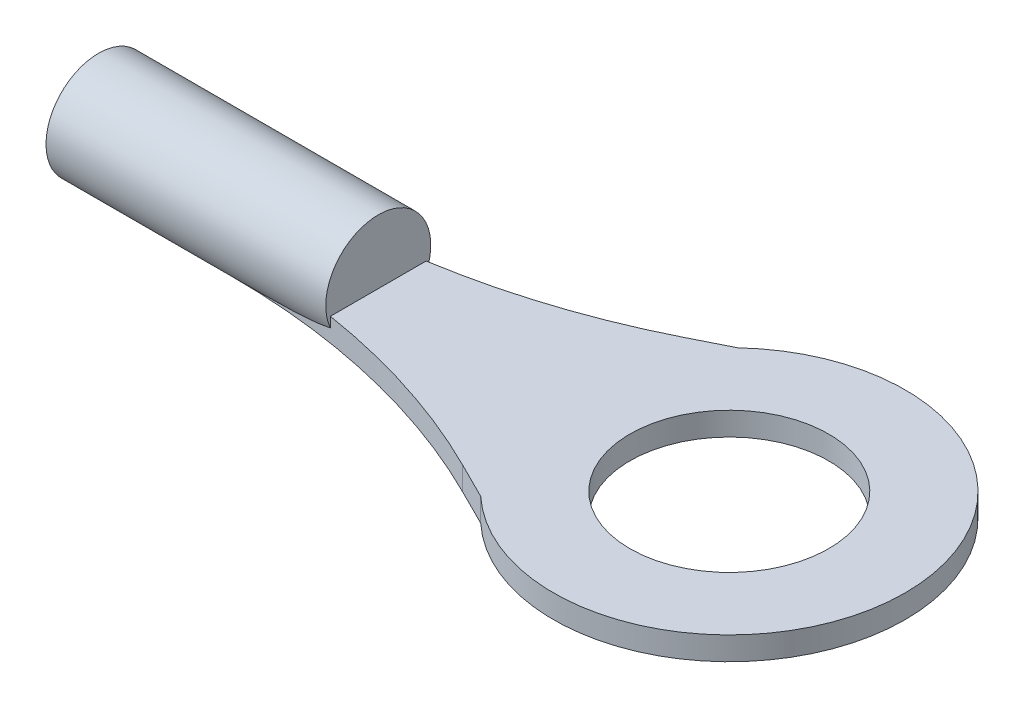
ISO-10303-21;
HEADER;
FILE_DESCRIPTION(('STEP AP214'),'2;1');
FILE_NAME('part.step','',(''),(''),'','','');
FILE_SCHEMA(('AUTOMOTIVE_DESIGN { 1 0 10303 214 1 1 1 1 }'));
ENDSEC;
DATA;
#1=APPLICATION_CONTEXT('core data for automotive mechanical design processes');
#2=APPLICATION_PROTOCOL_DEFINITION('international standard','automotive_design',2000,#1);
#3=PRODUCT_CONTEXT('',#1,'mechanical');
#4=PRODUCT('Part','Part','',(#3));
#5=PRODUCT_RELATED_PRODUCT_CATEGORY('part','',(#4));
#6=PRODUCT_DEFINITION_FORMATION('','',#4);
#7=PRODUCT_DEFINITION_CONTEXT('part definition',#1,'design');
#8=PRODUCT_DEFINITION('design','',#6,#7);
#9=PRODUCT_DEFINITION_SHAPE('','',#8);
#10=(LENGTH_UNIT() NAMED_UNIT(*) SI_UNIT(.MILLI.,.METRE.));
#11=(NAMED_UNIT(*) PLANE_ANGLE_UNIT() SI_UNIT($,.RADIAN.));
#12=(NAMED_UNIT(*) SI_UNIT($,.STERADIAN.) SOLID_ANGLE_UNIT());
#13=UNCERTAINTY_MEASURE_WITH_UNIT(LENGTH_MEASURE(1.E-05),#10,'distance_accuracy_value','');
#14=(GEOMETRIC_REPRESENTATION_CONTEXT(3) GLOBAL_UNCERTAINTY_ASSIGNED_CONTEXT((#13)) GLOBAL_UNIT_ASSIGNED_CONTEXT((#10,
#11,#12)) REPRESENTATION_CONTEXT('',''));
#15=CARTESIAN_POINT('',(0.,0.,0.));
#16=DIRECTION('',(0.,0.,1.));
#17=DIRECTION('',(1.,0.,0.));
#18=AXIS2_PLACEMENT_3D('',#15,#16,#17);
#19=CARTESIAN_POINT('',(0.,0.7874,0.));
#20=DIRECTION('',(0.,1.,0.));
#21=DIRECTION('',(0.,0.,1.));
#22=AXIS2_PLACEMENT_3D('',#19,#20,#21);
#23=PLANE('',#22);
#24=CARTESIAN_POINT('',(0.,0.7874,0.));
#25=DIRECTION('',(0.,1.,0.));
#26=DIRECTION('',(0.,0.,1.));
#27=AXIS2_PLACEMENT_3D('',#24,#25,#26);
#28=CIRCLE('',#27,3.3655);
#29=CARTESIAN_POINT('',(0.,0.7874,3.3655));
#30=VERTEX_POINT('',#29);
#31=EDGE_CURVE('E155',#30,#30,#28,.T.);
#32=ORIENTED_EDGE('',*,*,#31,.F.);
#33=EDGE_LOOP('',(#32));
#34=FACE_BOUND('',#33,.T.);
#35=CARTESIAN_POINT('',(-15.5033170761152,0.7874,-24.1935));
#36=DIRECTION('',(0.,-1.,0.));
#37=DIRECTION('',(0.,0.,1.));
#38=AXIS2_PLACEMENT_3D('',#35,#36,#37);
#39=CIRCLE('',#38,22.86);
#40=CARTESIAN_POINT('',(-5.28219031683111,0.7874,-3.74580654155224));
#41=VERTEX_POINT('',#40);
#42=CARTESIAN_POINT('',(-11.8872,0.7874,-1.62132028044637));
#43=VERTEX_POINT('',#42);
#44=EDGE_CURVE('E116',#41,#43,#39,.T.);
#45=ORIENTED_EDGE('',*,*,#44,.T.);
#46=DIRECTION('',(0.,0.,1.));
#47=VECTOR('',#46,1.);
#48=CARTESIAN_POINT('',(-11.8872,0.7874,0.));
#49=LINE('',#48,#47);
#50=CARTESIAN_POINT('',(-11.8872,0.7874,1.62132028044637));
#51=VERTEX_POINT('',#50);
#52=EDGE_CURVE('E120',#43,#51,#49,.T.);
#53=ORIENTED_EDGE('',*,*,#52,.T.);
#54=CARTESIAN_POINT('',(-15.5033170761152,0.7874,24.1935));
#55=DIRECTION('',(0.,-1.,0.));
#56=DIRECTION('',(0.,0.,-1.));
#57=AXIS2_PLACEMENT_3D('',#54,#55,#56);
#58=CIRCLE('',#57,22.86);
#59=CARTESIAN_POINT('',(-5.28219031683119,0.7874,3.74580654155221));
#60=VERTEX_POINT('',#59);
#61=EDGE_CURVE('E106',#51,#60,#58,.T.);
#62=ORIENTED_EDGE('',*,*,#61,.T.);
#63=DIRECTION('',(0.894474779459657,0.,0.447118405917939));
#64=VECTOR('',#63,1.);
#65=CARTESIAN_POINT('',(-5.28219031683119,0.7874,3.74580654155221));
#66=LINE('',#65,#64);
#67=CARTESIAN_POINT('',(-4.06337890915694,0.7874,4.35505011803751));
#68=VERTEX_POINT('',#67);
#69=EDGE_CURVE('E115',#60,#68,#66,.T.);
#70=ORIENTED_EDGE('',*,*,#69,.T.);
#71=CARTESIAN_POINT('',(0.,0.7874,0.));
#72=DIRECTION('',(0.,1.,0.));
#73=DIRECTION('',(0.,0.,1.));
#74=AXIS2_PLACEMENT_3D('',#71,#72,#73);
#75=CIRCLE('',#74,5.9563);
#76=CARTESIAN_POINT('',(-4.06337890915694,0.7874,-4.35505011803751));
#77=VERTEX_POINT('',#76);
#78=EDGE_CURVE('E144',#68,#77,#75,.T.);
#79=ORIENTED_EDGE('',*,*,#78,.T.);
#80=DIRECTION('',(-0.894474779459658,0.,0.447118405917937));
#81=VECTOR('',#80,1.);
#82=CARTESIAN_POINT('',(-4.06337890915694,0.7874,-4.35505011803751));
#83=LINE('',#82,#81);
#84=EDGE_CURVE('E158',#77,#41,#83,.T.);
#85=ORIENTED_EDGE('',*,*,#84,.T.);
#86=EDGE_LOOP('',(#45,#53,#62,#70,#79,#85));
#87=FACE_BOUND('',#86,.T.);
#88=ADVANCED_FACE('F39',(#34,#87),#23,.T.);
#89=CARTESIAN_POINT('',(0.,0.,0.));
#90=DIRECTION('',(0.,1.,0.));
#91=DIRECTION('',(0.,0.,1.));
#92=AXIS2_PLACEMENT_3D('',#89,#90,#91);
#93=PLANE('',#92);
#94=DIRECTION('',(0.,0.,1.));
#95=VECTOR('',#94,1.);
#96=CARTESIAN_POINT('',(-11.8872,0.,0.));
#97=LINE('',#96,#95);
#98=CARTESIAN_POINT('',(-11.8872,0.,-1.3335));
#99=VERTEX_POINT('',#98);
#100=CARTESIAN_POINT('',(-11.8872,0.,1.3335));
#101=VERTEX_POINT('',#100);
#102=EDGE_CURVE('E63',#99,#101,#97,.T.);
#103=ORIENTED_EDGE('',*,*,#102,.F.);
#104=DIRECTION('',(-1.,0.,0.));
#105=VECTOR('',#104,1.);
#106=CARTESIAN_POINT('',(-11.8872,0.,-1.3335));
#107=LINE('',#106,#105);
#108=CARTESIAN_POINT('',(-15.5033170761152,0.,-1.3335));
#109=VERTEX_POINT('',#108);
#110=EDGE_CURVE('E165',#99,#109,#107,.T.);
#111=ORIENTED_EDGE('',*,*,#110,.T.);
#112=CARTESIAN_POINT('',(-15.5033170761152,0.,-24.1935));
#113=DIRECTION('',(0.,-1.,0.));
#114=DIRECTION('',(0.,0.,1.));
#115=AXIS2_PLACEMENT_3D('',#112,#113,#114);
#116=CIRCLE('',#115,22.86);
#117=CARTESIAN_POINT('',(-5.28219031683111,0.,-3.74580654155224));
#118=VERTEX_POINT('',#117);
#119=EDGE_CURVE('E147',#118,#109,#116,.T.);
#120=ORIENTED_EDGE('',*,*,#119,.F.);
#121=DIRECTION('',(-0.894474779459658,0.,0.447118405917937));
#122=VECTOR('',#121,1.);
#123=CARTESIAN_POINT('',(-4.06337890915694,0.,-4.35505011803751));
#124=LINE('',#123,#122);
#125=CARTESIAN_POINT('',(-4.06337890915694,0.,-4.35505011803751));
#126=VERTEX_POINT('',#125);
#127=EDGE_CURVE('E150',#126,#118,#124,.T.);
#128=ORIENTED_EDGE('',*,*,#127,.F.);
#129=CARTESIAN_POINT('',(0.,0.,0.));
#130=DIRECTION('',(0.,1.,0.));
#131=DIRECTION('',(0.,0.,1.));
#132=AXIS2_PLACEMENT_3D('',#129,#130,#131);
#133=CIRCLE('',#132,5.9563);
#134=CARTESIAN_POINT('',(-4.06337890915694,0.,4.35505011803751));
#135=VERTEX_POINT('',#134);
#136=EDGE_CURVE('E152',#135,#126,#133,.T.);
#137=ORIENTED_EDGE('',*,*,#136,.F.);
#138=DIRECTION('',(0.894474779459657,0.,0.447118405917939));
#139=VECTOR('',#138,1.);
#140=CARTESIAN_POINT('',(-5.28219031683119,0.,3.74580654155221));
#141=LINE('',#140,#139);
#142=CARTESIAN_POINT('',(-5.28219031683119,0.,3.74580654155221));
#143=VERTEX_POINT('',#142);
#144=EDGE_CURVE('E142',#143,#135,#141,.T.);
#145=ORIENTED_EDGE('',*,*,#144,.F.);
#146=CARTESIAN_POINT('',(-15.5033170761152,0.,24.1935));
#147=DIRECTION('',(0.,-1.,0.));
#148=DIRECTION('',(0.,0.,-1.));
#149=AXIS2_PLACEMENT_3D('',#146,#147,#148);
#150=CIRCLE('',#149,22.86);
#151=CARTESIAN_POINT('',(-15.5033170761152,0.,1.3335));
#152=VERTEX_POINT('',#151);
#153=EDGE_CURVE('E145',#152,#143,#150,.T.);
#154=ORIENTED_EDGE('',*,*,#153,.F.);
#155=DIRECTION('',(-1.,0.,0.));
#156=VECTOR('',#155,1.);
#157=CARTESIAN_POINT('',(-11.8872,0.,1.3335));
#158=LINE('',#157,#156);
#159=EDGE_CURVE('E59',#152,#101,#158,.F.);
#160=ORIENTED_EDGE('',*,*,#159,.T.);
#161=EDGE_LOOP('',(#103,#111,#120,#128,#137,#145,#154,#160));
#162=FACE_BOUND('',#161,.T.);
#163=CARTESIAN_POINT('',(0.,0.,0.));
#164=DIRECTION('',(0.,1.,0.));
#165=DIRECTION('',(0.,0.,1.));
#166=AXIS2_PLACEMENT_3D('',#163,#164,#165);
#167=CIRCLE('',#166,3.3655);
#168=CARTESIAN_POINT('',(0.,0.,3.3655));
#169=VERTEX_POINT('',#168);
#170=EDGE_CURVE('E162',#169,#169,#167,.T.);
#171=ORIENTED_EDGE('',*,*,#170,.T.);
#172=EDGE_LOOP('',(#171));
#173=FACE_BOUND('',#172,.T.);
#174=ADVANCED_FACE('F195',(#162,#173),#93,.F.);
#175=CARTESIAN_POINT('',(0.,0.7874,0.));
#176=DIRECTION('',(0.,-1.,0.));
#177=DIRECTION('',(0.,0.,-1.));
#178=AXIS2_PLACEMENT_3D('',#175,#176,#177);
#179=CYLINDRICAL_SURFACE('',#178,5.9563);
#180=ORIENTED_EDGE('',*,*,#136,.T.);
#181=DIRECTION('',(0.,-1.,0.));
#182=VECTOR('',#181,1.);
#183=CARTESIAN_POINT('',(-4.06337890915694,0.7874,-4.35505011803751));
#184=LINE('',#183,#182);
#185=EDGE_CURVE('E131',#77,#126,#184,.T.);
#186=ORIENTED_EDGE('',*,*,#185,.F.);
#187=ORIENTED_EDGE('',*,*,#78,.F.);
#188=DIRECTION('',(0.,-1.,0.));
#189=VECTOR('',#188,1.);
#190=CARTESIAN_POINT('',(-4.06337890915694,0.7874,4.35505011803751));
#191=LINE('',#190,#189);
#192=EDGE_CURVE('E139',#68,#135,#191,.T.);
#193=ORIENTED_EDGE('',*,*,#192,.T.);
#194=EDGE_LOOP('',(#180,#186,#187,#193));
#195=FACE_BOUND('',#194,.T.);
#196=ADVANCED_FACE('F41',(#195),#179,.T.);
#197=CARTESIAN_POINT('',(-4.06337890915694,0.7874,-4.35505011803751));
#198=DIRECTION('',(0.447118405917937,0.,0.894474779459658));
#199=DIRECTION('',(0.894474779459658,0.,-0.447118405917937));
#200=AXIS2_PLACEMENT_3D('',#197,#198,#199);
#201=PLANE('',#200);
#202=ORIENTED_EDGE('',*,*,#127,.T.);
#203=DIRECTION('',(0.,-1.,0.));
#204=VECTOR('',#203,1.);
#205=CARTESIAN_POINT('',(-5.28219031683111,0.7874,-3.74580654155224));
#206=LINE('',#205,#204);
#207=EDGE_CURVE('E133',#41,#118,#206,.T.);
#208=ORIENTED_EDGE('',*,*,#207,.F.);
#209=ORIENTED_EDGE('',*,*,#84,.F.);
#210=ORIENTED_EDGE('',*,*,#185,.T.);
#211=EDGE_LOOP('',(#202,#208,#209,#210));
#212=FACE_BOUND('',#211,.T.);
#213=ADVANCED_FACE('F237',(#212),#201,.F.);
#214=CARTESIAN_POINT('',(-15.5033170761152,0.7874,-24.1935));
#215=DIRECTION('',(0.,-1.,0.));
#216=DIRECTION('',(0.,0.,-1.));
#217=AXIS2_PLACEMENT_3D('',#214,#215,#216);
#218=CYLINDRICAL_SURFACE('',#217,22.86);
#219=ORIENTED_EDGE('',*,*,#119,.T.);
#220=CARTESIAN_POINT('',(-11.8872,1.90583406547414,-1.62132028044637));
#221=CARTESIAN_POINT('',(-11.9356699069584,1.92307150326346,-1.61355480092599));
#222=CARTESIAN_POINT('',(-11.9844793737982,1.93936694956161,-1.60589603866104));
#223=CARTESIAN_POINT('',(-12.0826407955746,1.97030896344357,-1.59082242109607));
#224=CARTESIAN_POINT('',(-12.1319925862064,1.98495601609523,-1.58340749450025));
#225=CARTESIAN_POINT('',(-12.2805910133176,2.02676072352102,-1.56158334653978));
#226=CARTESIAN_POINT('',(-12.3804876448769,2.05181871159769,-1.54757758685708));
#227=CARTESIAN_POINT('',(-12.5811429436529,2.09750582603197,-1.52081329996605));
#228=CARTESIAN_POINT('',(-12.6818985656837,2.11814669528281,-1.50805151616284));
#229=CARTESIAN_POINT('',(-12.8842476190277,2.15589383225274,-1.48380016731164));
#230=CARTESIAN_POINT('',(-12.9858413094399,2.1729989607402,-1.47231101286226));
#231=CARTESIAN_POINT('',(-13.2897888111199,2.21963143549663,-1.44001340502922));
#232=CARTESIAN_POINT('',(-13.4930152620459,2.24484010441411,-1.42114668764038));
#233=CARTESIAN_POINT('',(-13.9009104152587,2.28651498149607,-1.38881153080896));
#234=CARTESIAN_POINT('',(-14.1055801614755,2.30297402025505,-1.37534752052663));
#235=CARTESIAN_POINT('',(-14.4581313986382,2.32502297500563,-1.3569282448408));
#236=CARTESIAN_POINT('',(-14.6058380440315,2.33236669229907,-1.3506456202205));
#237=CARTESIAN_POINT('',(-14.9014755526488,2.34359862698814,-1.34094500561565));
#238=CARTESIAN_POINT('',(-15.0494064248664,2.347486701898,-1.33752713375318));
#239=CARTESIAN_POINT('',(-15.4934219682031,2.35427035059865,-1.3315863065796));
#240=CARTESIAN_POINT('',(-15.7896774395654,2.35228225449442,-1.33337886731021));
#241=CARTESIAN_POINT('',(-16.2351236536459,2.33922642944983,-1.34472596933206));
#242=CARTESIAN_POINT('',(-16.3846048149256,2.33313394622735,-1.35000455124523));
#243=CARTESIAN_POINT('',(-16.6832366473792,2.31722667153037,-1.36348206926463));
#244=CARTESIAN_POINT('',(-16.8323873412676,2.30741214441129,-1.37168079796707));
#245=CARTESIAN_POINT('',(-17.1299760121004,2.2836218056341,-1.39096096083085));
#246=CARTESIAN_POINT('',(-17.2784146645825,2.26965143404652,-1.40203862403761));
#247=CARTESIAN_POINT('',(-17.5744984763992,2.23682885503189,-1.42703629213275));
#248=CARTESIAN_POINT('',(-17.722143762156,2.21797745044986,-1.44095582950271));
#249=CARTESIAN_POINT('',(-18.0170906003494,2.1741658218146,-1.47164592301104));
#250=CARTESIAN_POINT('',(-18.1643856118791,2.14917202137366,-1.48843198922609));
#251=CARTESIAN_POINT('',(-18.4575767079189,2.09130715521347,-1.52471552368915));
#252=CARTESIAN_POINT('',(-18.603467904455,2.0584148723711,-1.54422023459555));
#253=CARTESIAN_POINT('',(-18.8189664627151,2.00110771697237,-1.57511670125449));
#254=CARTESIAN_POINT('',(-18.8898020204603,1.98083114943545,-1.58561676758975));
#255=CARTESIAN_POINT('',(-19.0303629706516,1.93699153418728,-1.60711931156602));
#256=CARTESIAN_POINT('',(-19.100088715509,1.91342955390102,-1.61812162524993));
#257=CARTESIAN_POINT('',(-19.2376459590152,1.86227445752431,-1.64046863974344));
#258=CARTESIAN_POINT('',(-19.3054844548515,1.83469957563609,-1.65181161679089));
#259=CARTESIAN_POINT('',(-19.4386627885697,1.77418688784941,-1.67468138168326));
#260=CARTESIAN_POINT('',(-19.5040062209529,1.74125718636608,-1.68620786837087));
#261=CARTESIAN_POINT('',(-19.5923348681601,1.68999175724806,-1.70216410672024));
#262=CARTESIAN_POINT('',(-19.6171261569983,1.67481317756752,-1.70668644827365));
#263=CARTESIAN_POINT('',(-19.6658151444286,1.64305594477288,-1.71564809113328));
#264=CARTESIAN_POINT('',(-19.6897123140578,1.62647648121406,-1.72008734253078));
#265=CARTESIAN_POINT('',(-19.7594718268173,1.57445616740757,-1.73315846182355));
#266=CARTESIAN_POINT('',(-19.803705538212,1.53656594158757,-1.7415987160584));
#267=CARTESIAN_POINT('',(-19.8613226501607,1.47529101534429,-1.75273952481145));
#268=CARTESIAN_POINT('',(-19.8782878141333,1.45539801713089,-1.75604270023739));
#269=CARTESIAN_POINT('',(-19.9096944252155,1.41356787185754,-1.76218947870873));
#270=CARTESIAN_POINT('',(-19.9241331565399,1.39162856347335,-1.76503258696179));
#271=CARTESIAN_POINT('',(-19.9496504635692,1.34532775622421,-1.77007714751696));
#272=CARTESIAN_POINT('',(-19.9606768979458,1.32093556746624,-1.77226862459034));
#273=CARTESIAN_POINT('',(-19.9777603497394,1.27042201036762,-1.77567146697157));
#274=CARTESIAN_POINT('',(-19.9838338391327,1.24430668848715,-1.77688608083953));
#275=CARTESIAN_POINT('',(-19.9896503284328,1.19483577577831,-1.77804949008054));
#276=CARTESIAN_POINT('',(-19.9901224907093,1.1715703765492,-1.7781440825449));
#277=CARTESIAN_POINT('',(-19.9865479723402,1.12539549098813,-1.77742889726699));
#278=CARTESIAN_POINT('',(-19.982497505351,1.10248631918118,-1.7766183617518));
#279=CARTESIAN_POINT('',(-19.969988745497,1.05625325146348,-1.7741225372382));
#280=CARTESIAN_POINT('',(-19.9612411915616,1.033012987924,-1.7723798760138));
#281=CARTESIAN_POINT('',(-19.9401818098018,0.988289464571811,-1.76820297244311));
#282=CARTESIAN_POINT('',(-19.9278644005128,0.966809024222119,-1.76576764722941));
#283=CARTESIAN_POINT('',(-19.8924320896522,0.91333630435185,-1.75880018396889));
#284=CARTESIAN_POINT('',(-19.8672722072351,0.882766994070889,-1.7538865192696));
#285=CARTESIAN_POINT('',(-19.8128859741922,0.825660691677835,-1.74337767213147));
#286=CARTESIAN_POINT('',(-19.7836480734986,0.799135616991835,-1.7377805597945));
#287=CARTESIAN_POINT('',(-19.7136327948411,0.742027846802222,-1.7245335837152));
#288=CARTESIAN_POINT('',(-19.6719911262545,0.712547193832425,-1.71676424588724));
#289=CARTESIAN_POINT('',(-19.5860942248646,0.657686887687554,-1.70100234775099));
#290=CARTESIAN_POINT('',(-19.5418341418624,0.632315192489674,-1.69300938862654));
#291=CARTESIAN_POINT('',(-19.4514223825343,0.58468777484142,-1.67696868485681));
#292=CARTESIAN_POINT('',(-19.4052627518226,0.562447352601672,-1.66892085986461));
#293=CARTESIAN_POINT('',(-19.3118129984696,0.520598436830174,-1.65293196009905));
#294=CARTESIAN_POINT('',(-19.2645238949831,0.500987668879428,-1.64499079849165));
#295=CARTESIAN_POINT('',(-19.139006491359,0.452205849503955,-1.62432698122941));
#296=CARTESIAN_POINT('',(-19.0600696695532,0.42480280323486,-1.61174640773166));
#297=CARTESIAN_POINT('',(-18.9007202795589,0.374295124455457,-1.58722290751508));
#298=CARTESIAN_POINT('',(-18.8203069258085,0.351192857443834,-1.57528033426635));
#299=CARTESIAN_POINT('',(-18.6583204946491,0.308388778482429,-1.55211623004546));
#300=CARTESIAN_POINT('',(-18.5767455232561,0.288693432568128,-1.54089609498172));
#301=CARTESIAN_POINT('',(-18.4128505579504,0.252146097838272,-1.5192623367106));
#302=CARTESIAN_POINT('',(-18.3305304509315,0.235294548583148,-1.5088488383179));
#303=CARTESIAN_POINT('',(-18.0822026027008,0.188216161128733,-1.47881764981876));
#304=CARTESIAN_POINT('',(-17.9153521535879,0.161597210901097,-1.46048455925454));
#305=CARTESIAN_POINT('',(-17.5805234531766,0.115631164621899,-1.42744829493721));
#306=CARTESIAN_POINT('',(-17.4125465969716,0.0962763311966743,-1.41274126464954));
#307=CARTESIAN_POINT('',(-17.0762585867515,0.0634779570089017,-1.38705784318176));
#308=CARTESIAN_POINT('',(-16.9079500007023,0.0500166276683084,-1.37607024858658));
#309=CARTESIAN_POINT('',(-16.5707939114935,0.0280688990337147,-1.35781295380288));
#310=CARTESIAN_POINT('',(-16.4019463429022,0.0195831288006838,-1.35054372374279));
#311=CARTESIAN_POINT('',(-16.0638023032528,0.00709080366658949,-1.33974539984932));
#312=CARTESIAN_POINT('',(-15.8945055539666,0.00308866435632471,-1.33621999320359));
#313=CARTESIAN_POINT('',(-15.5558127700771,-0.000645262442621187,-1.33293289698569));
#314=CARTESIAN_POINT('',(-15.3864167273914,-0.000376632802714425,-1.33317157505394));
#315=CARTESIAN_POINT('',(-15.0487706053383,0.00443235525298777,-1.3373997628991));
#316=CARTESIAN_POINT('',(-14.8805198694271,0.00894650487238106,-1.34136625968983));
#317=CARTESIAN_POINT('',(-14.5443417832292,0.0224575597143305,-1.35300418410732));
#318=CARTESIAN_POINT('',(-14.3764143989177,0.0314539641265764,-1.36067519781887));
#319=CARTESIAN_POINT('',(-14.0412285253249,0.054443774824956,-1.37968719943902));
#320=CARTESIAN_POINT('',(-13.8739696385805,0.0684335443504978,-1.39102551582057));
#321=CARTESIAN_POINT('',(-13.540349500749,0.102280381760618,-1.41732078692466));
#322=CARTESIAN_POINT('',(-13.3739880613909,0.122136166097,-1.4322769498932));
#323=CARTESIAN_POINT('',(-13.0961556440474,0.161564677911858,-1.46031085811048));
#324=CARTESIAN_POINT('',(-12.9843080793238,0.179158083681195,-1.47243545785994));
#325=CARTESIAN_POINT('',(-12.7615502366606,0.218373955173261,-1.4982388694692));
#326=CARTESIAN_POINT('',(-12.6506395288108,0.239994454677352,-1.51191692159321));
#327=CARTESIAN_POINT('',(-12.4297878465473,0.288307729143274,-1.54078620210378));
#328=CARTESIAN_POINT('',(-12.3198501744535,0.31501364595946,-1.55598130138343));
#329=CARTESIAN_POINT('',(-12.1563648847848,0.360020912401536,-1.57977514701295));
#330=CARTESIAN_POINT('',(-12.10206841494,0.375861142571668,-1.58787943738196));
#331=CARTESIAN_POINT('',(-11.9941124065414,0.409502624789377,-1.60438597141674));
#332=CARTESIAN_POINT('',(-11.9404531053899,0.427304583838501,-1.61278832175784));
#333=CARTESIAN_POINT('',(-11.8872,0.446238850062289,-1.62132028044637));
#334=B_SPLINE_CURVE_WITH_KNOTS('',3,(#220,#221,#222,#223,#224,#225,#226,#227,#228,#229,#230,
#231,#232,#233,#234,#235,#236,#237,#238,#239,#240,#241,#242,#243,#244,#245,#246,#247,#248,#249,
#250,#251,#252,#253,#254,#255,#256,#257,#258,#259,#260,#261,#262,#263,#264,#265,#266,#267,#268,
#269,#270,#271,#272,#273,#274,#275,#276,#277,#278,#279,#280,#281,#282,#283,#284,#285,#286,#287,
#288,#289,#290,#291,#292,#293,#294,#295,#296,#297,#298,#299,#300,#301,#302,#303,#304,#305,#306,
#307,#308,#309,#310,#311,#312,#313,#314,#315,#316,#317,#318,#319,#320,#321,#322,#323,#324,#325,
#326,#327,#328,#329,#330,#331,#332,#333),.UNSPECIFIED.,.F.,.F.,(4,2,2,2,2,2,2,2,2,2,2,2,2,2,2,2,
2,2,2,2,2,2,2,2,2,2,2,2,2,2,2,2,2,2,2,2,2,2,2,2,2,2,2,2,2,2,2,2,2,2,2,2,2,2,2,2,4),(0.,
0.15605210710758,0.312058172488748,0.623727733592788,0.934558135848503,1.24548853348814,
1.86208139785695,2.4791787197673,2.92317509246734,3.36718977152588,4.2553757680036,
4.70441669852774,5.1534257422221,5.60184959269681,6.05019973205258,6.50105745294782,
6.95314010184328,7.17635478720775,7.39949711875537,7.62165546328673,7.8434806524789,
7.93168862553099,8.01994798305303,8.19541857307342,8.27432903723161,8.35332381181495,
8.43347202073652,8.51335258162152,8.58269968382813,8.65210488696654,8.72637858536729,
8.80076904292291,8.91977970778065,9.03913455969508,9.19360312140818,9.34836736029914,
9.50386335831577,9.65922398638154,9.91253836790149,10.1659916674565,10.4199208434223,
10.6738892328766,11.1834617866767,11.6924900184212,12.1999710575556,12.7075162437961,
13.2155608349149,13.7236550473612,14.2286330966487,14.7335547364883,15.2381093803953,
15.7425537038941,16.0840940845715,16.4254681440453,16.7677366658144,16.9391157300443,
17.1105567620622),.UNSPECIFIED.);
#335=CARTESIAN_POINT('',(-11.8872,0.446238850062282,-1.62132028044637));
#336=VERTEX_POINT('',#335);
#337=EDGE_CURVE('E169',#109,#336,#334,.T.);
#338=ORIENTED_EDGE('',*,*,#337,.T.);
#339=DIRECTION('',(0.,-1.,0.));
#340=VECTOR('',#339,1.);
#341=CARTESIAN_POINT('',(-11.8872,0.7874,-1.62132028044637));
#342=LINE('',#341,#340);
#343=EDGE_CURVE('E124',#43,#336,#342,.T.);
#344=ORIENTED_EDGE('',*,*,#343,.F.);
#345=ORIENTED_EDGE('',*,*,#44,.F.);
#346=ORIENTED_EDGE('',*,*,#207,.T.);
#347=EDGE_LOOP('',(#219,#338,#344,#345,#346));
#348=FACE_BOUND('',#347,.T.);
#349=ADVANCED_FACE('F176',(#348),#218,.F.);
#350=CARTESIAN_POINT('',(-15.5033170761152,0.7874,24.1935));
#351=DIRECTION('',(0.,-1.,0.));
#352=DIRECTION('',(0.,0.,-1.));
#353=AXIS2_PLACEMENT_3D('',#350,#351,#352);
#354=CYLINDRICAL_SURFACE('',#353,22.86);
#355=DIRECTION('',(0.,-1.,0.));
#356=VECTOR('',#355,1.);
#357=CARTESIAN_POINT('',(-11.8872,0.7874,1.62132028044637));
#358=LINE('',#357,#356);
#359=CARTESIAN_POINT('',(-11.8872,0.446238850062273,1.62132028044637));
#360=VERTEX_POINT('',#359);
#361=EDGE_CURVE('E52',#360,#51,#358,.F.);
#362=ORIENTED_EDGE('',*,*,#361,.F.);
#363=CARTESIAN_POINT('',(-11.8872,0.446238850062273,1.62132028044637));
#364=CARTESIAN_POINT('',(-11.9356699069584,0.429001412272952,1.61355480092599));
#365=CARTESIAN_POINT('',(-11.9844793737982,0.412705965974795,1.60589603866104));
#366=CARTESIAN_POINT('',(-12.0826407955746,0.381763952092844,1.59082242109607));
#367=CARTESIAN_POINT('',(-12.1319925862064,0.367116899441185,1.58340749450025));
#368=CARTESIAN_POINT('',(-12.2805910133176,0.325312192015387,1.56158334653977));
#369=CARTESIAN_POINT('',(-12.3804876448769,0.300254203938721,1.54757758685708));
#370=CARTESIAN_POINT('',(-12.5811429436529,0.254567089504431,1.52081329996604));
#371=CARTESIAN_POINT('',(-12.6818985656837,0.233926220253602,1.50805151616284));
#372=CARTESIAN_POINT('',(-12.8842476190277,0.196179083283667,1.48380016731163));
#373=CARTESIAN_POINT('',(-12.9858413094399,0.179073954796209,1.47231101286225));
#374=CARTESIAN_POINT('',(-13.2897888111199,0.132441480039769,1.44001340502921));
#375=CARTESIAN_POINT('',(-13.4930152620459,0.107232811122292,1.42114668764037));
#376=CARTESIAN_POINT('',(-13.9009104152587,0.0655579340403456,1.38881153080896));
#377=CARTESIAN_POINT('',(-14.1055801614756,0.0490988952813657,1.37534752052663));
#378=CARTESIAN_POINT('',(-14.4581313986382,0.0270499405307803,1.3569282448408));
#379=CARTESIAN_POINT('',(-14.6058380440316,0.0197062232373359,1.35064562022049));
#380=CARTESIAN_POINT('',(-14.9014755526489,0.00847428854826624,1.34094500561564));
#381=CARTESIAN_POINT('',(-15.0494064248664,0.00458621363840602,1.33752713375317));
#382=CARTESIAN_POINT('',(-15.4934219682031,-0.00219743506224044,1.3315863065796));
#383=CARTESIAN_POINT('',(-15.7896774395654,-0.000209338958006336,1.33337886731021));
#384=CARTESIAN_POINT('',(-16.2351236536459,0.0128464860865854,1.34472596933205));
#385=CARTESIAN_POINT('',(-16.3846048149256,0.0189389693090585,1.35000455124522));
#386=CARTESIAN_POINT('',(-16.6832366473792,0.0348462440060396,1.36348206926462));
#387=CARTESIAN_POINT('',(-16.8323873412676,0.0446607711251252,1.37168079796706));
#388=CARTESIAN_POINT('',(-17.1299760121004,0.0684511099023091,1.39096096083085));
#389=CARTESIAN_POINT('',(-17.2784146645825,0.082421481489891,1.40203862403761));
#390=CARTESIAN_POINT('',(-17.5744984763993,0.115244060504522,1.42703629213275));
#391=CARTESIAN_POINT('',(-17.722143762156,0.134095465086554,1.44095582950271));
#392=CARTESIAN_POINT('',(-18.0170906003494,0.177907093721816,1.47164592301104));
#393=CARTESIAN_POINT('',(-18.1643856118792,0.202900894162744,1.48843198922609));
#394=CARTESIAN_POINT('',(-18.4575767079189,0.260765760322942,1.52471552368914));
#395=CARTESIAN_POINT('',(-18.603467904455,0.293658043165309,1.54422023459555));
#396=CARTESIAN_POINT('',(-18.8189664627151,0.350965198564034,1.57511670125449));
#397=CARTESIAN_POINT('',(-18.8898020204603,0.37124176610095,1.58561676758974));
#398=CARTESIAN_POINT('',(-19.0303629706516,0.415081381349116,1.60711931156601));
#399=CARTESIAN_POINT('',(-19.100088715509,0.438643361635379,1.61812162524992));
#400=CARTESIAN_POINT('',(-19.2376459590152,0.489798458012087,1.64046863974344));
#401=CARTESIAN_POINT('',(-19.3054844548515,0.517373339900299,1.65181161679088));
#402=CARTESIAN_POINT('',(-19.4386627885697,0.577886027686979,1.67468138168325));
#403=CARTESIAN_POINT('',(-19.5040062209529,0.610815729170319,1.68620786837086));
#404=CARTESIAN_POINT('',(-19.5923348681601,0.662081158288333,1.70216410672023));
#405=CARTESIAN_POINT('',(-19.6171261569983,0.677259737968868,1.70668644827364));
#406=CARTESIAN_POINT('',(-19.6658151444286,0.70901697076352,1.71564809113328));
#407=CARTESIAN_POINT('',(-19.6897123140578,0.725596434322343,1.72008734253078));
#408=CARTESIAN_POINT('',(-19.7594718268173,0.777616748128848,1.73315846182355));
#409=CARTESIAN_POINT('',(-19.8037055382121,0.815506973948844,1.7415987160584));
#410=CARTESIAN_POINT('',(-19.8613226501607,0.876781900192131,1.75273952481146));
#411=CARTESIAN_POINT('',(-19.8782878141334,0.896674898405526,1.75604270023739));
#412=CARTESIAN_POINT('',(-19.9096944252155,0.938505043678874,1.76218947870873));
#413=CARTESIAN_POINT('',(-19.9241331565399,0.960444352063063,1.7650325869618));
#414=CARTESIAN_POINT('',(-19.9496504635692,1.0067451593122,1.77007714751697));
#415=CARTESIAN_POINT('',(-19.9606768979458,1.03113734807017,1.77226862459034));
#416=CARTESIAN_POINT('',(-19.9777603497394,1.08165090516879,1.77567146697157));
#417=CARTESIAN_POINT('',(-19.9838338391327,1.10776622704926,1.77688608083953));
#418=CARTESIAN_POINT('',(-19.9896503284329,1.15723713975809,1.77804949008054));
#419=CARTESIAN_POINT('',(-19.9901224907094,1.18050253898721,1.7781440825449));
#420=CARTESIAN_POINT('',(-19.9865479723403,1.22667742454828,1.777428897267));
#421=CARTESIAN_POINT('',(-19.9824975053511,1.24958659635523,1.77661836175181));
#422=CARTESIAN_POINT('',(-19.969988745497,1.29581966407293,1.7741225372382));
#423=CARTESIAN_POINT('',(-19.9612411915616,1.31905992761241,1.77237987601381));
#424=CARTESIAN_POINT('',(-19.9401818098019,1.3637834509646,1.76820297244312));
#425=CARTESIAN_POINT('',(-19.9278644005129,1.38526389131428,1.76576764722941));
#426=CARTESIAN_POINT('',(-19.8924320896523,1.43873661118455,1.7588001839689));
#427=CARTESIAN_POINT('',(-19.8672722072352,1.46930592146551,1.75388651926961));
#428=CARTESIAN_POINT('',(-19.8128859741923,1.52641222385856,1.74337767213148));
#429=CARTESIAN_POINT('',(-19.7836480734987,1.55293729854455,1.73778055979451));
#430=CARTESIAN_POINT('',(-19.7136327948412,1.61004506873416,1.72453358371522));
#431=CARTESIAN_POINT('',(-19.6719911262546,1.63952572170396,1.71676424588725));
#432=CARTESIAN_POINT('',(-19.5860942248648,1.69438602784883,1.70100234775101));
#433=CARTESIAN_POINT('',(-19.5418341418626,1.7197577230467,1.69300938862656));
#434=CARTESIAN_POINT('',(-19.4514223825345,1.76738514069495,1.67696868485683));
#435=CARTESIAN_POINT('',(-19.4052627518228,1.7896255629347,1.66892085986464));
#436=CARTESIAN_POINT('',(-19.3118129984698,1.83147447870619,1.65293196009908));
#437=CARTESIAN_POINT('',(-19.2645238949833,1.85108524665692,1.64499079849168));
#438=CARTESIAN_POINT('',(-19.1390064913592,1.89986706603239,1.62432698122945));
#439=CARTESIAN_POINT('',(-19.0600696695534,1.92727011230149,1.6117464077317));
#440=CARTESIAN_POINT('',(-18.9007202795592,1.9777777910809,1.58722290751512));
#441=CARTESIAN_POINT('',(-18.8203069258088,2.00088005809252,1.57528033426639));
#442=CARTESIAN_POINT('',(-18.6583204946495,2.04368413705392,1.5521162300455));
#443=CARTESIAN_POINT('',(-18.5767455232565,2.06337948296822,1.54089609498177));
#444=CARTESIAN_POINT('',(-18.4128505579508,2.09992681769807,1.51926233671065));
#445=CARTESIAN_POINT('',(-18.3305304509319,2.1167783669532,1.50884883831795));
#446=CARTESIAN_POINT('',(-18.0822026027013,2.16385675440762,1.47881764981881));
#447=CARTESIAN_POINT('',(-17.9153521535885,2.19047570463525,1.4604845592546));
#448=CARTESIAN_POINT('',(-17.5805234531772,2.23644175091445,1.42744829493727));
#449=CARTESIAN_POINT('',(-17.4125465969723,2.25579658433968,1.4127412646496));
#450=CARTESIAN_POINT('',(-17.0762585867523,2.28859495852746,1.38705784318181));
#451=CARTESIAN_POINT('',(-16.9079500007031,2.30205628786806,1.37607024858662));
#452=CARTESIAN_POINT('',(-16.5707939114944,2.32400401650266,1.35781295380292));
#453=CARTESIAN_POINT('',(-16.4019463429032,2.3324897867357,1.35054372374282));
#454=CARTESIAN_POINT('',(-16.0638023032538,2.34498211186981,1.33974539984934));
#455=CARTESIAN_POINT('',(-15.8945055539677,2.34898425118008,1.33621999320361));
#456=CARTESIAN_POINT('',(-15.5558127700783,2.35271817797905,1.33293289698569));
#457=CARTESIAN_POINT('',(-15.3864167273927,2.35244954833915,1.33317157505393));
#458=CARTESIAN_POINT('',(-15.0487706053397,2.34764056028347,1.33739976289907));
#459=CARTESIAN_POINT('',(-14.8805198694285,2.34312641066409,1.34136625968979));
#460=CARTESIAN_POINT('',(-14.5443417832307,2.32961535582217,1.35300418410726));
#461=CARTESIAN_POINT('',(-14.3764143989192,2.32061895140994,1.36067519781879));
#462=CARTESIAN_POINT('',(-14.0412285253265,2.2976291407116,1.37968719943891));
#463=CARTESIAN_POINT('',(-13.8739696385822,2.28363937118608,1.39102551582045));
#464=CARTESIAN_POINT('',(-13.5403495007507,2.24979253377602,1.4173207869245));
#465=CARTESIAN_POINT('',(-13.3739880613927,2.22993674943966,1.43227694989302));
#466=CARTESIAN_POINT('',(-13.0961556440491,2.19050823762483,1.4603108581103));
#467=CARTESIAN_POINT('',(-12.9843080793253,2.17291483185548,1.47243545785977));
#468=CARTESIAN_POINT('',(-12.7615502366618,2.1336989603634,1.49823886946906));
#469=CARTESIAN_POINT('',(-12.6506395288119,2.11207846085929,1.51191692159308));
#470=CARTESIAN_POINT('',(-12.4297878465481,2.06376518639334,1.54078620210368));
#471=CARTESIAN_POINT('',(-12.3198501744541,2.03705926957713,1.55598130138334));
#472=CARTESIAN_POINT('',(-12.1563648847851,1.99205200313501,1.57977514701289));
#473=CARTESIAN_POINT('',(-12.1020684149403,1.97621177296485,1.58787943738192));
#474=CARTESIAN_POINT('',(-11.9941124065415,1.9425702907471,1.60438597141672));
#475=CARTESIAN_POINT('',(-11.94045310539,1.92476833169796,1.61278832175782));
#476=CARTESIAN_POINT('',(-11.8872,1.90583406547415,1.62132028044637));
#477=B_SPLINE_CURVE_WITH_KNOTS('',3,(#363,#364,#365,#366,#367,#368,#369,#370,#371,#372,#373,
#374,#375,#376,#377,#378,#379,#380,#381,#382,#383,#384,#385,#386,#387,#388,#389,#390,#391,#392,
#393,#394,#395,#396,#397,#398,#399,#400,#401,#402,#403,#404,#405,#406,#407,#408,#409,#410,#411,
#412,#413,#414,#415,#416,#417,#418,#419,#420,#421,#422,#423,#424,#425,#426,#427,#428,#429,#430,
#431,#432,#433,#434,#435,#436,#437,#438,#439,#440,#441,#442,#443,#444,#445,#446,#447,#448,#449,
#450,#451,#452,#453,#454,#455,#456,#457,#458,#459,#460,#461,#462,#463,#464,#465,#466,#467,#468,
#469,#470,#471,#472,#473,#474,#475,#476),.UNSPECIFIED.,.F.,.F.,(4,2,2,2,2,2,2,2,2,2,2,2,2,2,2,2,
2,2,2,2,2,2,2,2,2,2,2,2,2,2,2,2,2,2,2,2,2,2,2,2,2,2,2,2,2,2,2,2,2,2,2,2,2,2,2,2,4),(0.,
0.156052107107586,0.312058172488754,0.623727733592798,0.934558135848515,1.24548853348816,
1.86208139785698,2.47917871976733,2.92317509246737,3.3671897715259,4.25537576800362,
4.70441669852775,5.15342574222212,5.60184959269682,6.05019973205259,6.50105745294782,
6.95314010184329,7.17635478720775,7.39949711875538,7.62165546328673,7.8434806524789,
7.93168862553101,8.01994798305305,8.19541857307347,8.27432903723166,8.353323811815,
8.43347202073657,8.51335258162156,8.58269968382818,8.65210488696659,8.72637858536734,
8.80076904292295,8.91977970778069,9.0391345596951,9.19360312140817,9.3483673602991,
9.50386335831569,9.65922398638143,9.91253836790131,10.1659916674563,10.419920843422,
10.6738892328762,11.1834617866762,11.6924900184205,12.1999710575548,12.7075162437952,
13.2155608349138,13.72365504736,14.2286330966474,14.7335547364869,15.2381093803937,
15.7425537038924,16.0840940845702,16.4254681440445,16.7677366658141,16.9391157300442,
17.1105567620624),.UNSPECIFIED.);
#478=EDGE_CURVE('E11',#360,#152,#477,.T.);
#479=ORIENTED_EDGE('',*,*,#478,.T.);
#480=ORIENTED_EDGE('',*,*,#153,.T.);
#481=DIRECTION('',(0.,-1.,0.));
#482=VECTOR('',#481,1.);
#483=CARTESIAN_POINT('',(-5.28219031683119,0.7874,3.74580654155221));
#484=LINE('',#483,#482);
#485=EDGE_CURVE('E112',#60,#143,#484,.T.);
#486=ORIENTED_EDGE('',*,*,#485,.F.);
#487=ORIENTED_EDGE('',*,*,#61,.F.);
#488=EDGE_LOOP('',(#362,#479,#480,#486,#487));
#489=FACE_BOUND('',#488,.T.);
#490=ADVANCED_FACE('F108',(#489),#354,.F.);
#491=CARTESIAN_POINT('',(-5.28219031683119,0.7874,3.74580654155221));
#492=DIRECTION('',(0.447118405917939,0.,-0.894474779459657));
#493=DIRECTION('',(-0.894474779459657,0.,-0.447118405917939));
#494=AXIS2_PLACEMENT_3D('',#491,#492,#493);
#495=PLANE('',#494);
#496=ORIENTED_EDGE('',*,*,#144,.T.);
#497=ORIENTED_EDGE('',*,*,#192,.F.);
#498=ORIENTED_EDGE('',*,*,#69,.F.);
#499=ORIENTED_EDGE('',*,*,#485,.T.);
#500=EDGE_LOOP('',(#496,#497,#498,#499));
#501=FACE_BOUND('',#500,.T.);
#502=ADVANCED_FACE('F191',(#501),#495,.F.);
#503=CARTESIAN_POINT('',(0.,0.7874,0.));
#504=DIRECTION('',(0.,-1.,0.));
#505=DIRECTION('',(0.,0.,-1.));
#506=AXIS2_PLACEMENT_3D('',#503,#504,#505);
#507=CYLINDRICAL_SURFACE('',#506,3.3655);
#508=ORIENTED_EDGE('',*,*,#31,.T.);
#509=EDGE_LOOP('',(#508));
#510=FACE_BOUND('',#509,.T.);
#511=ORIENTED_EDGE('',*,*,#170,.F.);
#512=EDGE_LOOP('',(#511));
#513=FACE_BOUND('',#512,.T.);
#514=ADVANCED_FACE('F185',(#510,#513),#507,.F.);
#515=CARTESIAN_POINT('',(-11.8872,1.17603645776821,0.));
#516=DIRECTION('',(-1.,0.,0.));
#517=DIRECTION('',(0.,0.,1.));
#518=AXIS2_PLACEMENT_3D('',#515,#516,#517);
#519=CYLINDRICAL_SURFACE('',#518,1.778);
#520=ORIENTED_EDGE('',*,*,#337,.F.);
#521=ORIENTED_EDGE('',*,*,#110,.F.);
#522=CARTESIAN_POINT('',(-11.8872,1.17603645776821,0.));
#523=DIRECTION('',(-1.,0.,0.));
#524=DIRECTION('',(0.,0.,1.));
#525=AXIS2_PLACEMENT_3D('',#522,#523,#524);
#526=CIRCLE('',#525,1.778);
#527=EDGE_CURVE('E125',#99,#101,#526,.T.);
#528=ORIENTED_EDGE('',*,*,#527,.T.);
#529=ORIENTED_EDGE('',*,*,#159,.F.);
#530=ORIENTED_EDGE('',*,*,#478,.F.);
#531=EDGE_CURVE('E130',#360,#336,#526,.T.);
#532=ORIENTED_EDGE('',*,*,#531,.T.);
#533=EDGE_LOOP('',(#520,#521,#528,#529,#530,#532));
#534=FACE_BOUND('',#533,.T.);
#535=CARTESIAN_POINT('',(-21.3614,1.17603645776821,0.));
#536=DIRECTION('',(-1.,0.,0.));
#537=DIRECTION('',(0.,0.,1.));
#538=AXIS2_PLACEMENT_3D('',#535,#536,#537);
#539=CIRCLE('',#538,1.778);
#540=CARTESIAN_POINT('',(-21.3614,1.17603645776821,1.778));
#541=VERTEX_POINT('',#540);
#542=EDGE_CURVE('E219',#541,#541,#539,.T.);
#543=ORIENTED_EDGE('',*,*,#542,.F.);
#544=EDGE_LOOP('',(#543));
#545=FACE_BOUND('',#544,.T.);
#546=ADVANCED_FACE('F179',(#534,#545),#519,.T.);
#547=CARTESIAN_POINT('',(-11.8872,1.17603645776821,0.));
#548=DIRECTION('',(-1.,0.,0.));
#549=DIRECTION('',(0.,0.,1.));
#550=AXIS2_PLACEMENT_3D('',#547,#548,#549);
#551=PLANE('',#550);
#552=ORIENTED_EDGE('',*,*,#527,.F.);
#553=ORIENTED_EDGE('',*,*,#102,.T.);
#554=EDGE_LOOP('',(#552,#553));
#555=FACE_BOUND('',#554,.T.);
#556=ADVANCED_FACE('F184',(#555),#551,.F.);
#557=ORIENTED_EDGE('',*,*,#52,.F.);
#558=ORIENTED_EDGE('',*,*,#343,.T.);
#559=ORIENTED_EDGE('',*,*,#531,.F.);
#560=ORIENTED_EDGE('',*,*,#361,.T.);
#561=EDGE_LOOP('',(#557,#558,#559,#560));
#562=FACE_BOUND('',#561,.T.);
#563=ADVANCED_FACE('F128',(#562),#551,.F.);
#564=CARTESIAN_POINT('',(-21.3614,0.7874,0.));
#565=DIRECTION('',(1.,0.,0.));
#566=DIRECTION('',(0.,0.,-1.));
#567=AXIS2_PLACEMENT_3D('',#564,#565,#566);
#568=PLANE('',#567);
#569=CARTESIAN_POINT('',(-21.3614,1.17603645776821,0.));
#570=DIRECTION('',(-1.,0.,0.));
#571=DIRECTION('',(0.,0.,1.));
#572=AXIS2_PLACEMENT_3D('',#569,#570,#571);
#573=CIRCLE('',#572,1.33657635720905);
#574=CARTESIAN_POINT('',(-21.3614,1.17603645776821,1.33657635720906));
#575=VERTEX_POINT('',#574);
#576=EDGE_CURVE('E216',#575,#575,#573,.T.);
#577=ORIENTED_EDGE('',*,*,#576,.F.);
#578=EDGE_LOOP('',(#577));
#579=FACE_BOUND('',#578,.T.);
#580=ORIENTED_EDGE('',*,*,#542,.T.);
#581=EDGE_LOOP('',(#580));
#582=FACE_BOUND('',#581,.T.);
#583=ADVANCED_FACE('F203',(#579,#582),#568,.F.);
#584=CARTESIAN_POINT('',(-16.9672,1.17603645776821,0.));
#585=DIRECTION('',(-1.,0.,0.));
#586=DIRECTION('',(0.,0.,1.));
#587=AXIS2_PLACEMENT_3D('',#584,#585,#586);
#588=CYLINDRICAL_SURFACE('',#587,1.33657635720905);
#589=CARTESIAN_POINT('',(-16.9672,1.17603645776821,0.));
#590=DIRECTION('',(-1.,0.,0.));
#591=DIRECTION('',(0.,0.,1.));
#592=AXIS2_PLACEMENT_3D('',#589,#590,#591);
#593=CIRCLE('',#592,1.33657635720905);
#594=CARTESIAN_POINT('',(-16.9672,1.17603645776821,1.33657635720906));
#595=VERTEX_POINT('',#594);
#596=EDGE_CURVE('E221',#595,#595,#593,.T.);
#597=ORIENTED_EDGE('',*,*,#596,.F.);
#598=EDGE_LOOP('',(#597));
#599=FACE_BOUND('',#598,.T.);
#600=ORIENTED_EDGE('',*,*,#576,.T.);
#601=EDGE_LOOP('',(#600));
#602=FACE_BOUND('',#601,.T.);
#603=ADVANCED_FACE('F205',(#599,#602),#588,.F.);
#604=CARTESIAN_POINT('',(-16.9672,1.17603645776821,0.));
#605=DIRECTION('',(-1.,0.,0.));
#606=DIRECTION('',(0.,0.,1.));
#607=AXIS2_PLACEMENT_3D('',#604,#605,#606);
#608=PLANE('',#607);
#609=ORIENTED_EDGE('',*,*,#596,.T.);
#610=EDGE_LOOP('',(#609));
#611=FACE_BOUND('',#610,.T.);
#612=ADVANCED_FACE('F211',(#611),#608,.T.);
#613=CLOSED_SHELL('',(#88,#174,#196,#213,#349,#490,#502,#514,#546,#556,#563,#583,#603,#612));
#614=MANIFOLD_SOLID_BREP('B2',#613);
#615=ADVANCED_BREP_SHAPE_REPRESENTATION('',(#18,#614),#14);
#616=SHAPE_DEFINITION_REPRESENTATION(#9,#615);
ENDSEC;
END-ISO-10303-21;
